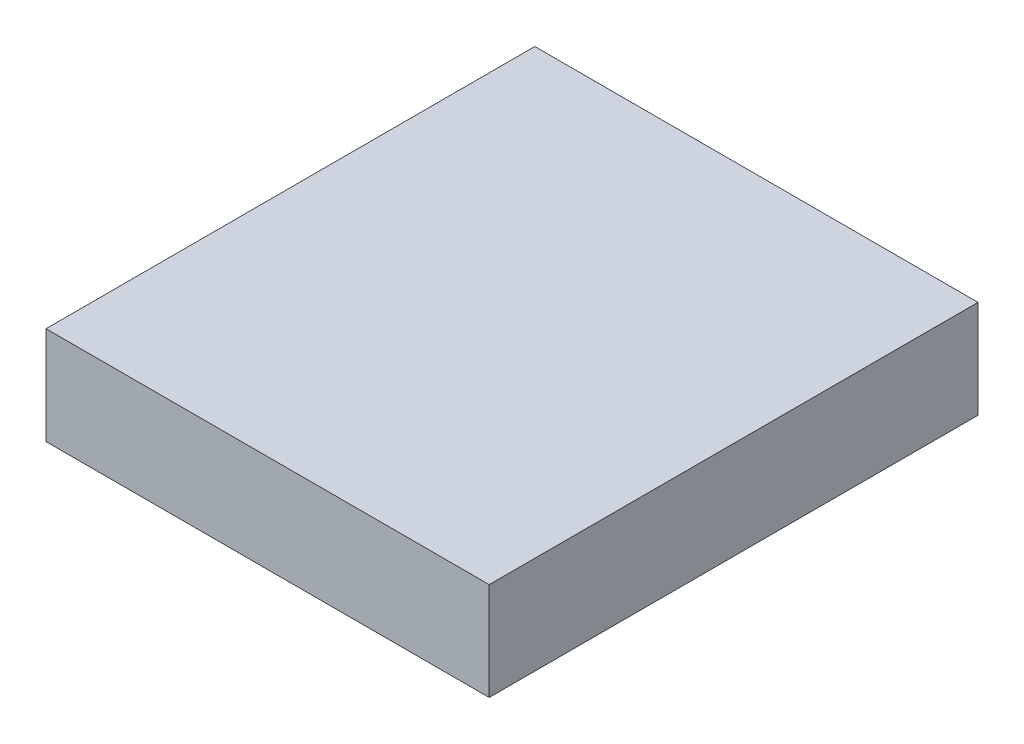
ISO-10303-21;
HEADER;
FILE_DESCRIPTION(('STEP AP214'),'2;1');
FILE_NAME('part.step','',(''),(''),'','','');
FILE_SCHEMA(('AUTOMOTIVE_DESIGN { 1 0 10303 214 1 1 1 1 }'));
ENDSEC;
DATA;
#1=APPLICATION_CONTEXT('core data for automotive mechanical design processes');
#2=APPLICATION_PROTOCOL_DEFINITION('international standard','automotive_design',2000,#1);
#3=PRODUCT_CONTEXT('',#1,'mechanical');
#4=PRODUCT('Part','Part','',(#3));
#5=PRODUCT_RELATED_PRODUCT_CATEGORY('part','',(#4));
#6=PRODUCT_DEFINITION_FORMATION('','',#4);
#7=PRODUCT_DEFINITION_CONTEXT('part definition',#1,'design');
#8=PRODUCT_DEFINITION('design','',#6,#7);
#9=PRODUCT_DEFINITION_SHAPE('','',#8);
#10=(LENGTH_UNIT() NAMED_UNIT(*) SI_UNIT(.MILLI.,.METRE.));
#11=(NAMED_UNIT(*) PLANE_ANGLE_UNIT() SI_UNIT($,.RADIAN.));
#12=(NAMED_UNIT(*) SI_UNIT($,.STERADIAN.) SOLID_ANGLE_UNIT());
#13=UNCERTAINTY_MEASURE_WITH_UNIT(LENGTH_MEASURE(1.E-05),#10,'distance_accuracy_value','');
#14=(GEOMETRIC_REPRESENTATION_CONTEXT(3) GLOBAL_UNCERTAINTY_ASSIGNED_CONTEXT((#13)) GLOBAL_UNIT_ASSIGNED_CONTEXT((#10,
#11,#12)) REPRESENTATION_CONTEXT('',''));
#15=CARTESIAN_POINT('',(0.,0.,0.));
#16=DIRECTION('',(0.,0.,1.));
#17=DIRECTION('',(1.,0.,0.));
#18=AXIS2_PLACEMENT_3D('',#15,#16,#17);
#19=CARTESIAN_POINT('',(-25.908,11.43,-28.575));
#20=DIRECTION('',(1.,0.,0.));
#21=DIRECTION('',(0.,0.,-1.));
#22=AXIS2_PLACEMENT_3D('',#19,#20,#21);
#23=PLANE('',#22);
#24=DIRECTION('',(0.,0.,1.));
#25=VECTOR('',#24,1.);
#26=CARTESIAN_POINT('',(-25.908,0.,-28.575));
#27=LINE('',#26,#25);
#28=CARTESIAN_POINT('',(-25.908,0.,-28.575));
#29=VERTEX_POINT('',#28);
#30=CARTESIAN_POINT('',(-25.908,0.,28.575));
#31=VERTEX_POINT('',#30);
#32=EDGE_CURVE('E111',#29,#31,#27,.T.);
#33=ORIENTED_EDGE('',*,*,#32,.T.);
#34=DIRECTION('',(0.,-1.,0.));
#35=VECTOR('',#34,1.);
#36=CARTESIAN_POINT('',(-25.908,11.43,28.575));
#37=LINE('',#36,#35);
#38=CARTESIAN_POINT('',(-25.908,11.43,28.575));
#39=VERTEX_POINT('',#38);
#40=EDGE_CURVE('E11',#39,#31,#37,.T.);
#41=ORIENTED_EDGE('',*,*,#40,.F.);
#42=DIRECTION('',(0.,0.,1.));
#43=VECTOR('',#42,1.);
#44=CARTESIAN_POINT('',(-25.908,11.43,-28.575));
#45=LINE('',#44,#43);
#46=CARTESIAN_POINT('',(-25.908,11.43,-28.575));
#47=VERTEX_POINT('',#46);
#48=EDGE_CURVE('E95',#47,#39,#45,.T.);
#49=ORIENTED_EDGE('',*,*,#48,.F.);
#50=DIRECTION('',(0.,-1.,0.));
#51=VECTOR('',#50,1.);
#52=CARTESIAN_POINT('',(-25.908,11.43,-28.575));
#53=LINE('',#52,#51);
#54=EDGE_CURVE('E107',#47,#29,#53,.T.);
#55=ORIENTED_EDGE('',*,*,#54,.T.);
#56=EDGE_LOOP('',(#33,#41,#49,#55));
#57=FACE_BOUND('',#56,.T.);
#58=ADVANCED_FACE('F43',(#57),#23,.F.);
#59=CARTESIAN_POINT('',(25.908,11.43,28.575));
#60=DIRECTION('',(0.,0.,-1.));
#61=DIRECTION('',(-1.,0.,0.));
#62=AXIS2_PLACEMENT_3D('',#59,#60,#61);
#63=PLANE('',#62);
#64=DIRECTION('',(1.,0.,0.));
#65=VECTOR('',#64,1.);
#66=CARTESIAN_POINT('',(25.908,0.,28.575));
#67=LINE('',#66,#65);
#68=CARTESIAN_POINT('',(25.908,0.,28.575));
#69=VERTEX_POINT('',#68);
#70=EDGE_CURVE('E100',#31,#69,#67,.T.);
#71=ORIENTED_EDGE('',*,*,#70,.T.);
#72=DIRECTION('',(0.,-1.,0.));
#73=VECTOR('',#72,1.);
#74=CARTESIAN_POINT('',(25.908,11.43,28.575));
#75=LINE('',#74,#73);
#76=CARTESIAN_POINT('',(25.908,11.43,28.575));
#77=VERTEX_POINT('',#76);
#78=EDGE_CURVE('E52',#77,#69,#75,.T.);
#79=ORIENTED_EDGE('',*,*,#78,.F.);
#80=DIRECTION('',(1.,0.,0.));
#81=VECTOR('',#80,1.);
#82=CARTESIAN_POINT('',(25.908,11.43,28.575));
#83=LINE('',#82,#81);
#84=EDGE_CURVE('E90',#39,#77,#83,.T.);
#85=ORIENTED_EDGE('',*,*,#84,.F.);
#86=ORIENTED_EDGE('',*,*,#40,.T.);
#87=EDGE_LOOP('',(#71,#79,#85,#86));
#88=FACE_BOUND('',#87,.T.);
#89=ADVANCED_FACE('F99',(#88),#63,.F.);
#90=CARTESIAN_POINT('',(25.908,11.43,-28.575));
#91=DIRECTION('',(-1.,0.,0.));
#92=DIRECTION('',(0.,0.,1.));
#93=AXIS2_PLACEMENT_3D('',#90,#91,#92);
#94=PLANE('',#93);
#95=DIRECTION('',(0.,0.,-1.));
#96=VECTOR('',#95,1.);
#97=CARTESIAN_POINT('',(25.908,0.,-28.575));
#98=LINE('',#97,#96);
#99=CARTESIAN_POINT('',(25.908,0.,-28.575));
#100=VERTEX_POINT('',#99);
#101=EDGE_CURVE('E77',#69,#100,#98,.T.);
#102=ORIENTED_EDGE('',*,*,#101,.T.);
#103=DIRECTION('',(0.,-1.,0.));
#104=VECTOR('',#103,1.);
#105=CARTESIAN_POINT('',(25.908,11.43,-28.575));
#106=LINE('',#105,#104);
#107=CARTESIAN_POINT('',(25.908,11.43,-28.575));
#108=VERTEX_POINT('',#107);
#109=EDGE_CURVE('E102',#108,#100,#106,.T.);
#110=ORIENTED_EDGE('',*,*,#109,.F.);
#111=DIRECTION('',(0.,0.,-1.));
#112=VECTOR('',#111,1.);
#113=CARTESIAN_POINT('',(25.908,11.43,-28.575));
#114=LINE('',#113,#112);
#115=EDGE_CURVE('E93',#77,#108,#114,.T.);
#116=ORIENTED_EDGE('',*,*,#115,.F.);
#117=ORIENTED_EDGE('',*,*,#78,.T.);
#118=EDGE_LOOP('',(#102,#110,#116,#117));
#119=FACE_BOUND('',#118,.T.);
#120=ADVANCED_FACE('F103',(#119),#94,.F.);
#121=CARTESIAN_POINT('',(25.908,11.43,-28.575));
#122=DIRECTION('',(0.,0.,1.));
#123=DIRECTION('',(1.,0.,0.));
#124=AXIS2_PLACEMENT_3D('',#121,#122,#123);
#125=PLANE('',#124);
#126=DIRECTION('',(-1.,0.,0.));
#127=VECTOR('',#126,1.);
#128=CARTESIAN_POINT('',(25.908,0.,-28.575));
#129=LINE('',#128,#127);
#130=EDGE_CURVE('E83',#100,#29,#129,.T.);
#131=ORIENTED_EDGE('',*,*,#130,.T.);
#132=ORIENTED_EDGE('',*,*,#54,.F.);
#133=DIRECTION('',(-1.,0.,0.));
#134=VECTOR('',#133,1.);
#135=CARTESIAN_POINT('',(25.908,11.43,-28.575));
#136=LINE('',#135,#134);
#137=EDGE_CURVE('E60',#108,#47,#136,.T.);
#138=ORIENTED_EDGE('',*,*,#137,.F.);
#139=ORIENTED_EDGE('',*,*,#109,.T.);
#140=EDGE_LOOP('',(#131,#132,#138,#139));
#141=FACE_BOUND('',#140,.T.);
#142=ADVANCED_FACE('F124',(#141),#125,.F.);
#143=CARTESIAN_POINT('',(0.,11.43,0.));
#144=DIRECTION('',(0.,-1.,0.));
#145=DIRECTION('',(0.,0.,-1.));
#146=AXIS2_PLACEMENT_3D('',#143,#144,#145);
#147=PLANE('',#146);
#148=ORIENTED_EDGE('',*,*,#48,.T.);
#149=ORIENTED_EDGE('',*,*,#84,.T.);
#150=ORIENTED_EDGE('',*,*,#115,.T.);
#151=ORIENTED_EDGE('',*,*,#137,.T.);
#152=EDGE_LOOP('',(#148,#149,#150,#151));
#153=FACE_BOUND('',#152,.T.);
#154=ADVANCED_FACE('F91',(#153),#147,.F.);
#155=CARTESIAN_POINT('',(0.,0.,0.));
#156=DIRECTION('',(0.,-1.,0.));
#157=DIRECTION('',(0.,0.,-1.));
#158=AXIS2_PLACEMENT_3D('',#155,#156,#157);
#159=PLANE('',#158);
#160=ORIENTED_EDGE('',*,*,#32,.F.);
#161=ORIENTED_EDGE('',*,*,#130,.F.);
#162=ORIENTED_EDGE('',*,*,#101,.F.);
#163=ORIENTED_EDGE('',*,*,#70,.F.);
#164=EDGE_LOOP('',(#160,#161,#162,#163));
#165=FACE_BOUND('',#164,.T.);
#166=ADVANCED_FACE('F127',(#165),#159,.T.);
#167=CLOSED_SHELL('',(#58,#89,#120,#142,#154,#166));
#168=MANIFOLD_SOLID_BREP('B2',#167);
#169=ADVANCED_BREP_SHAPE_REPRESENTATION('',(#18,#168),#14);
#170=SHAPE_DEFINITION_REPRESENTATION(#9,#169);
ENDSEC;
END-ISO-10303-21;
